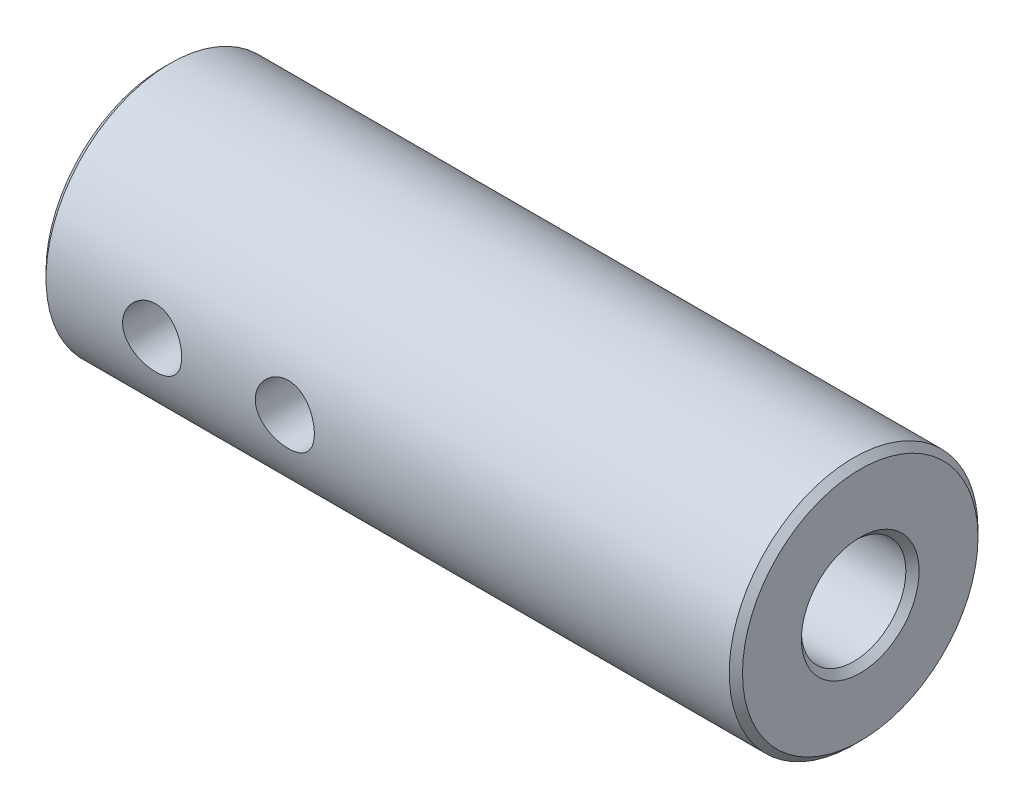
ISO-10303-21;
HEADER;
FILE_DESCRIPTION(('STEP AP214'),'2;1');
FILE_NAME('part.step','',(''),(''),'','','');
FILE_SCHEMA(('AUTOMOTIVE_DESIGN { 1 0 10303 214 1 1 1 1 }'));
ENDSEC;
DATA;
#1=APPLICATION_CONTEXT('core data for automotive mechanical design processes');
#2=APPLICATION_PROTOCOL_DEFINITION('international standard','automotive_design',2000,#1);
#3=PRODUCT_CONTEXT('',#1,'mechanical');
#4=PRODUCT('Part','Part','',(#3));
#5=PRODUCT_RELATED_PRODUCT_CATEGORY('part','',(#4));
#6=PRODUCT_DEFINITION_FORMATION('','',#4);
#7=PRODUCT_DEFINITION_CONTEXT('part definition',#1,'design');
#8=PRODUCT_DEFINITION('design','',#6,#7);
#9=PRODUCT_DEFINITION_SHAPE('','',#8);
#10=(LENGTH_UNIT() NAMED_UNIT(*) SI_UNIT(.MILLI.,.METRE.));
#11=(NAMED_UNIT(*) PLANE_ANGLE_UNIT() SI_UNIT($,.RADIAN.));
#12=(NAMED_UNIT(*) SI_UNIT($,.STERADIAN.) SOLID_ANGLE_UNIT());
#13=UNCERTAINTY_MEASURE_WITH_UNIT(LENGTH_MEASURE(1.E-05),#10,'distance_accuracy_value','');
#14=(GEOMETRIC_REPRESENTATION_CONTEXT(3) GLOBAL_UNCERTAINTY_ASSIGNED_CONTEXT((#13)) GLOBAL_UNIT_ASSIGNED_CONTEXT((#10,
#11,#12)) REPRESENTATION_CONTEXT('',''));
#15=CARTESIAN_POINT('',(0.,0.,0.));
#16=DIRECTION('',(0.,0.,1.));
#17=DIRECTION('',(1.,0.,0.));
#18=AXIS2_PLACEMENT_3D('',#15,#16,#17);
#19=CARTESIAN_POINT('',(13.335,0.,0.));
#20=DIRECTION('',(-1.,0.,0.));
#21=DIRECTION('',(0.,0.,1.));
#22=AXIS2_PLACEMENT_3D('',#19,#20,#21);
#23=CYLINDRICAL_SURFACE('',#22,4.7625);
#24=CARTESIAN_POINT('',(13.081,0.,0.));
#25=DIRECTION('',(1.,0.,0.));
#26=DIRECTION('',(0.,0.,-1.));
#27=AXIS2_PLACEMENT_3D('',#24,#25,#26);
#28=CIRCLE('',#27,4.7625);
#29=CARTESIAN_POINT('',(13.081,0.,-4.7625));
#30=VERTEX_POINT('',#29);
#31=EDGE_CURVE('E11',#30,#30,#28,.F.);
#32=ORIENTED_EDGE('',*,*,#31,.T.);
#33=EDGE_LOOP('',(#32));
#34=FACE_BOUND('',#33,.T.);
#35=CARTESIAN_POINT('',(-13.081,0.,0.));
#36=DIRECTION('',(1.,0.,0.));
#37=DIRECTION('',(0.,0.,-1.));
#38=AXIS2_PLACEMENT_3D('',#35,#36,#37);
#39=CIRCLE('',#38,4.7625);
#40=CARTESIAN_POINT('',(-13.081,0.,-4.7625));
#41=VERTEX_POINT('',#40);
#42=EDGE_CURVE('E41',#41,#41,#39,.T.);
#43=ORIENTED_EDGE('',*,*,#42,.T.);
#44=EDGE_LOOP('',(#43));
#45=FACE_BOUND('',#44,.T.);
#46=DIRECTION('',(-1.,0.,0.));
#47=VECTOR('',#46,1.);
#48=CARTESIAN_POINT('',(13.335,1.190625,-4.61127079657821));
#49=LINE('',#48,#47);
#50=CARTESIAN_POINT('',(4.7625,1.190625,-4.61127079657821));
#51=VERTEX_POINT('',#50);
#52=CARTESIAN_POINT('',(-7.9375,1.190625,-4.6112707965782));
#53=VERTEX_POINT('',#52);
#54=EDGE_CURVE('E56',#51,#53,#49,.T.);
#55=ORIENTED_EDGE('',*,*,#54,.T.);
#56=CARTESIAN_POINT('',(-7.9375,1.190625,-4.6112707965782));
#57=CARTESIAN_POINT('',(-7.97043624164247,1.19062540183131,-4.61126858153273));
#58=CARTESIAN_POINT('',(-8.00335616315608,1.1892574569063,-4.61162411846089));
#59=CARTESIAN_POINT('',(-8.06894980453331,1.18380426108057,-4.61302780372209));
#60=CARTESIAN_POINT('',(-8.10162356488994,1.17971946742247,-4.61407583550883));
#61=CARTESIAN_POINT('',(-8.19878643435178,1.16344926938982,-4.61821662126101));
#62=CARTESIAN_POINT('',(-8.26260785778663,1.14724778706475,-4.6223063249905));
#63=CARTESIAN_POINT('',(-8.38651406472165,1.10465958453277,-4.63266737518841));
#64=CARTESIAN_POINT('',(-8.44659919874718,1.07827382145776,-4.63893851663701));
#65=CARTESIAN_POINT('',(-8.56152019354573,1.01609768446205,-4.65295219480652));
#66=CARTESIAN_POINT('',(-8.61635464133268,0.980304788684349,-4.66069512592942));
#67=CARTESIAN_POINT('',(-8.72038818439445,0.899498699270296,-4.67696862417649));
#68=CARTESIAN_POINT('',(-8.76945503643607,0.854317810645922,-4.68551169943803));
#69=CARTESIAN_POINT('',(-8.85940342529035,0.756375226177138,-4.70231514921718));
#70=CARTESIAN_POINT('',(-8.90028365371027,0.703612320879485,-4.71057547837146));
#71=CARTESIAN_POINT('',(-8.9732377863022,0.59109399585014,-4.72602142030992));
#72=CARTESIAN_POINT('',(-9.00518093865592,0.531251327085735,-4.73319044011685));
#73=CARTESIAN_POINT('',(-9.05850288665295,0.406839647222352,-4.74550199754607));
#74=CARTESIAN_POINT('',(-9.07988376143199,0.342271569173836,-4.75064493395316));
#75=CARTESIAN_POINT('',(-9.11105023827563,0.211626579212771,-4.75823637193606));
#76=CARTESIAN_POINT('',(-9.12106182247842,0.145606677134655,-4.76073731423111));
#77=CARTESIAN_POINT('',(-9.12991495174374,0.0127787110460022,-4.76294574798315));
#78=CARTESIAN_POINT('',(-9.12875790076025,-0.0540292528466751,-4.76265359054695));
#79=CARTESIAN_POINT('',(-9.11546869948701,-0.1849665619449,-4.75934766988579));
#80=CARTESIAN_POINT('',(-9.10358072211125,-0.249122448009013,-4.75639445925233));
#81=CARTESIAN_POINT('',(-9.06955972884804,-0.37449765288479,-4.74816881164078));
#82=CARTESIAN_POINT('',(-9.04742625966991,-0.435716841636058,-4.74289627204928));
#83=CARTESIAN_POINT('',(-8.99334472520151,-0.554125549922964,-4.73053169210141));
#84=CARTESIAN_POINT('',(-8.96130963374153,-0.611273577745175,-4.72342361400933));
#85=CARTESIAN_POINT('',(-8.88840083604203,-0.719466864058233,-4.70815922660848));
#86=CARTESIAN_POINT('',(-8.84752579822976,-0.770511201341348,-4.70000275945464));
#87=CARTESIAN_POINT('',(-8.75679417030319,-0.86650042962167,-4.68327064545974));
#88=CARTESIAN_POINT('',(-8.70672514524479,-0.911243775823818,-4.67468962599994));
#89=CARTESIAN_POINT('',(-8.59969006468917,-0.991754400456112,-4.65827469113145));
#90=CARTESIAN_POINT('',(-8.54272212749676,-1.02751922176052,-4.65044098059939));
#91=CARTESIAN_POINT('',(-8.42310164759108,-1.0891893569936,-4.63638678051219));
#92=CARTESIAN_POINT('',(-8.3604201621081,-1.11504057442203,-4.63017519967129));
#93=CARTESIAN_POINT('',(-8.23144515710198,-1.1557424876712,-4.6201852939215));
#94=CARTESIAN_POINT('',(-8.16515719746222,-1.17060962840569,-4.61640333259709));
#95=CARTESIAN_POINT('',(-8.07149605603393,-1.18336770622658,-4.6131395546769));
#96=CARTESIAN_POINT('',(-8.04475185336181,-1.18608966049473,-4.61243985328867));
#97=CARTESIAN_POINT('',(-7.99117600638921,-1.18971626463346,-4.61150568150935));
#98=CARTESIAN_POINT('',(-7.96434457425323,-1.1906238547331,-4.61127045842546));
#99=CARTESIAN_POINT('',(-7.9375,-1.190625,-4.61127079657821));
#100=B_SPLINE_CURVE_WITH_KNOTS('',3,(#56,#57,#58,#59,#60,#61,#62,#63,#64,#65,#66,#67,#68,#69,
#70,#71,#72,#73,#74,#75,#76,#77,#78,#79,#80,#81,#82,#83,#84,#85,#86,#87,#88,#89,#90,#91,#92,#93,
#94,#95,#96,#97,#98,#99),.UNSPECIFIED.,.F.,.F.,(4,2,2,2,2,2,2,2,2,2,2,2,2,2,2,2,2,2,2,2,2,4),
(0.,0.0987463064357856,0.197475998182037,0.394370674792503,0.591246851490192,0.788175860534038,
0.988983009125182,1.1898222253076,1.39346210263836,1.59706187840793,1.79653979554183,
1.99599263761811,2.19101843211262,2.3860528559467,2.58285269064354,2.77968219023154,
2.98181827039564,3.18400960837339,3.38728907441771,3.59026357852295,3.67088557385403,
3.75137681268021),.UNSPECIFIED.);
#101=CARTESIAN_POINT('',(-7.9375,-1.190625,-4.6112707965782));
#102=VERTEX_POINT('',#101);
#103=EDGE_CURVE('E137',#53,#102,#100,.T.);
#104=ORIENTED_EDGE('',*,*,#103,.T.);
#105=DIRECTION('',(-1.,0.,0.));
#106=VECTOR('',#105,1.);
#107=CARTESIAN_POINT('',(13.335,-1.190625,-4.6112707965782));
#108=LINE('',#107,#106);
#109=CARTESIAN_POINT('',(4.7625,-1.190625,-4.6112707965782));
#110=VERTEX_POINT('',#109);
#111=EDGE_CURVE('E136',#102,#110,#108,.F.);
#112=ORIENTED_EDGE('',*,*,#111,.T.);
#113=CARTESIAN_POINT('',(4.7625,-1.190625,-4.61127079657821));
#114=CARTESIAN_POINT('',(4.79543624164248,-1.19062540183131,-4.61126858153273));
#115=CARTESIAN_POINT('',(4.82835616315608,-1.1892574569063,-4.61162411846089));
#116=CARTESIAN_POINT('',(4.89394980453331,-1.18380426108057,-4.61302780372209));
#117=CARTESIAN_POINT('',(4.92662356488994,-1.17971946742247,-4.61407583550884));
#118=CARTESIAN_POINT('',(5.02378643435178,-1.16344926938982,-4.61821662126101));
#119=CARTESIAN_POINT('',(5.08760785778663,-1.14724778706475,-4.62230632499051));
#120=CARTESIAN_POINT('',(5.21151406472165,-1.10465958453277,-4.63266737518841));
#121=CARTESIAN_POINT('',(5.27159919874718,-1.07827382145775,-4.63893851663701));
#122=CARTESIAN_POINT('',(5.38652019354573,-1.01609768446205,-4.65295219480652));
#123=CARTESIAN_POINT('',(5.44135464133268,-0.980304788684347,-4.66069512592942));
#124=CARTESIAN_POINT('',(5.54538818439445,-0.899498699270294,-4.67696862417649));
#125=CARTESIAN_POINT('',(5.59445503643607,-0.854317810645921,-4.68551169943803));
#126=CARTESIAN_POINT('',(5.68440342529035,-0.756375226177137,-4.70231514921718));
#127=CARTESIAN_POINT('',(5.72528365371027,-0.703612320879484,-4.71057547837146));
#128=CARTESIAN_POINT('',(5.7982377863022,-0.591093995850138,-4.72602142030992));
#129=CARTESIAN_POINT('',(5.83018093865592,-0.531251327085733,-4.73319044011685));
#130=CARTESIAN_POINT('',(5.88350288665295,-0.406839647222351,-4.74550199754607));
#131=CARTESIAN_POINT('',(5.90488376143199,-0.342271569173833,-4.75064493395316));
#132=CARTESIAN_POINT('',(5.93605023827563,-0.211626579212769,-4.75823637193606));
#133=CARTESIAN_POINT('',(5.94606182247842,-0.145606677134652,-4.76073731423111));
#134=CARTESIAN_POINT('',(5.95491495174374,-0.0127787110459995,-4.76294574798315));
#135=CARTESIAN_POINT('',(5.95375790076025,0.0540292528466779,-4.76265359054695));
#136=CARTESIAN_POINT('',(5.94046869948701,0.184966561944902,-4.75934766988579));
#137=CARTESIAN_POINT('',(5.92858072211125,0.249122448009015,-4.75639445925233));
#138=CARTESIAN_POINT('',(5.89455972884804,0.374497652884792,-4.74816881164078));
#139=CARTESIAN_POINT('',(5.87242625966991,0.43571684163606,-4.74289627204928));
#140=CARTESIAN_POINT('',(5.81834472520151,0.554125549922967,-4.73053169210141));
#141=CARTESIAN_POINT('',(5.78630963374152,0.611273577745177,-4.72342361400933));
#142=CARTESIAN_POINT('',(5.71340083604203,0.719466864058236,-4.70815922660848));
#143=CARTESIAN_POINT('',(5.67252579822976,0.77051120134135,-4.70000275945464));
#144=CARTESIAN_POINT('',(5.58179417030319,0.866500429621671,-4.68327064545974));
#145=CARTESIAN_POINT('',(5.53172514524479,0.91124377582382,-4.67468962599994));
#146=CARTESIAN_POINT('',(5.42469006468917,0.991754400456114,-4.65827469113145));
#147=CARTESIAN_POINT('',(5.36772212749676,1.02751922176053,-4.65044098059939));
#148=CARTESIAN_POINT('',(5.24810164759108,1.0891893569936,-4.63638678051219));
#149=CARTESIAN_POINT('',(5.1854201621081,1.11504057442203,-4.63017519967129));
#150=CARTESIAN_POINT('',(5.05644515710198,1.1557424876712,-4.6201852939215));
#151=CARTESIAN_POINT('',(4.99015719746222,1.17060962840569,-4.61640333259709));
#152=CARTESIAN_POINT('',(4.89649605603393,1.18336770622659,-4.6131395546769));
#153=CARTESIAN_POINT('',(4.86975185336181,1.18608966049474,-4.61243985328867));
#154=CARTESIAN_POINT('',(4.81617600638921,1.18971626463346,-4.61150568150935));
#155=CARTESIAN_POINT('',(4.78934457425323,1.1906238547331,-4.61127045842546));
#156=CARTESIAN_POINT('',(4.7625,1.190625,-4.61127079657821));
#157=B_SPLINE_CURVE_WITH_KNOTS('',3,(#113,#114,#115,#116,#117,#118,#119,#120,#121,#122,#123,
#124,#125,#126,#127,#128,#129,#130,#131,#132,#133,#134,#135,#136,#137,#138,#139,#140,#141,#142,
#143,#144,#145,#146,#147,#148,#149,#150,#151,#152,#153,#154,#155,#156),.UNSPECIFIED.,.F.,.F.,(4,
2,2,2,2,2,2,2,2,2,2,2,2,2,2,2,2,2,2,2,2,4),(0.,0.0987463064357882,0.197475998182038,
0.394370674792503,0.591246851490191,0.788175860534037,0.988983009125181,1.1898222253076,
1.39346210263836,1.59706187840793,1.79653979554184,1.99599263761811,2.19101843211262,
2.3860528559467,2.58285269064354,2.77968219023154,2.98181827039564,3.18400960837339,
3.38728907441771,3.59026357852296,3.67088557385403,3.75137681268021),.UNSPECIFIED.);
#158=EDGE_CURVE('E48',#110,#51,#157,.T.);
#159=ORIENTED_EDGE('',*,*,#158,.T.);
#160=EDGE_LOOP('',(#55,#104,#112,#159));
#161=FACE_BOUND('',#160,.T.);
#162=CARTESIAN_POINT('',(-7.88670000000001,0.,4.7625));
#163=CARTESIAN_POINT('',(-7.88670192760851,-0.0625504471650137,4.76249888658254));
#164=CARTESIAN_POINT('',(-7.89190978170714,-0.125123129283413,4.76125531619252));
#165=CARTESIAN_POINT('',(-7.91257643964307,-0.248481844038287,4.75641479439014));
#166=CARTESIAN_POINT('',(-7.92804168852836,-0.309266728250471,4.75281636336276));
#167=CARTESIAN_POINT('',(-7.96870413752154,-0.427250047842574,4.74366551356278));
#168=CARTESIAN_POINT('',(-7.99389028274124,-0.484452471724354,4.73811531503235));
#169=CARTESIAN_POINT('',(-8.05324225159371,-0.593819309373721,4.72565533763748));
#170=CARTESIAN_POINT('',(-8.08740815753329,-0.645983676957435,4.71874554631142));
#171=CARTESIAN_POINT('',(-8.16442511212147,-0.744769781920513,4.70417494660862));
#172=CARTESIAN_POINT('',(-8.2074122351177,-0.791283867055913,4.69650348465821));
#173=CARTESIAN_POINT('',(-8.30055970815086,-0.876514301242979,4.68134670992166));
#174=CARTESIAN_POINT('',(-8.35072079200094,-0.915229851617912,4.67386141627044));
#175=CARTESIAN_POINT('',(-8.4576113977317,-0.984257303274571,4.65981813018725));
#176=CARTESIAN_POINT('',(-8.51441905054017,-1.01445122919643,4.6532737183417));
#177=CARTESIAN_POINT('',(-8.63248371233283,-1.06482048280172,4.64200756588757));
#178=CARTESIAN_POINT('',(-8.69374008507448,-1.08499723988878,4.63728556525076));
#179=CARTESIAN_POINT('',(-8.81778609663537,-1.1143969583754,4.63030798184956));
#180=CARTESIAN_POINT('',(-8.88052766049331,-1.12381226659384,4.62800914824603));
#181=CARTESIAN_POINT('',(-9.00673867644944,-1.1320205269598,4.62600854277725));
#182=CARTESIAN_POINT('',(-9.0702080211146,-1.1308150272652,4.62630639240253));
#183=CARTESIAN_POINT('',(-9.19461764875476,-1.11796991019263,4.62942650333921));
#184=CARTESIAN_POINT('',(-9.25558293054618,-1.10655703472154,4.63219390421103));
#185=CARTESIAN_POINT('',(-9.37470790680083,-1.07398179717215,4.63985416565764));
#186=CARTESIAN_POINT('',(-9.4328674188249,-1.05281880205468,4.64474716423846));
#187=CARTESIAN_POINT('',(-9.5453502308673,-1.00114461591173,4.65615920388045));
#188=CARTESIAN_POINT('',(-9.59963324911748,-0.97054909223566,4.66269281104616));
#189=CARTESIAN_POINT('',(-9.70237719592243,-0.900937448372102,4.6766413798207));
#190=CARTESIAN_POINT('',(-9.7508371973354,-0.861919990000867,4.68405648140832));
#191=CARTESIAN_POINT('',(-9.84186151096834,-0.775386694919819,4.69916539760802));
#192=CARTESIAN_POINT('',(-9.88424314962247,-0.727678881710187,4.70686148789115));
#193=CARTESIAN_POINT('',(-9.96043697261253,-0.625742654598686,4.72149336042034));
#194=CARTESIAN_POINT('',(-9.99424894353392,-0.571514078356699,4.72842912372917));
#195=CARTESIAN_POINT('',(-10.0524013650433,-0.45783091870798,4.7407880498009));
#196=CARTESIAN_POINT('',(-10.07671456182,-0.39836188911095,4.7462068476709));
#197=CARTESIAN_POINT('',(-10.1149498440921,-0.276024255491214,4.75488931700387));
#198=CARTESIAN_POINT('',(-10.1288737157628,-0.21315623783065,4.75815335891022));
#199=CARTESIAN_POINT('',(-10.1456617208301,-0.0873691590361525,4.76210460266796));
#200=CARTESIAN_POINT('',(-10.1487749309216,-0.0244851159606706,4.76284982691246));
#201=CARTESIAN_POINT('',(-10.1445330105785,0.100904914262535,4.76184360723796));
#202=CARTESIAN_POINT('',(-10.1371787238294,0.163410931471559,4.76009236453545));
#203=CARTESIAN_POINT('',(-10.1124164653175,0.285421966304747,4.75432693440289));
#204=CARTESIAN_POINT('',(-10.0951421786054,0.344955665814232,4.75034285425274));
#205=CARTESIAN_POINT('',(-10.0511811543474,0.460278770394102,4.74055923690496));
#206=CARTESIAN_POINT('',(-10.0244935239573,0.516067819691336,4.73475952750301));
#207=CARTESIAN_POINT('',(-9.96196553746852,0.623325436186185,4.72184709836335));
#208=CARTESIAN_POINT('',(-9.92598280285455,0.674708549514257,4.71471447952687));
#209=CARTESIAN_POINT('',(-9.84607027324923,0.770796159921665,4.69996242077331));
#210=CARTESIAN_POINT('',(-9.80213924971063,0.815499622590925,4.69234290571582));
#211=CARTESIAN_POINT('',(-9.70642588749361,0.897968165505122,4.6772704338935));
#212=CARTESIAN_POINT('',(-9.6544923671793,0.935559392964989,4.66982480514445));
#213=CARTESIAN_POINT('',(-9.54490504386739,1.00149022808019,4.65613164810588));
#214=CARTESIAN_POINT('',(-9.48725149699102,1.0298302497261,4.64988406620905));
#215=CARTESIAN_POINT('',(-9.36817540302122,1.0762491323619,4.63935996173661));
#216=CARTESIAN_POINT('',(-9.30677744713415,1.09438832132569,4.63507187952516));
#217=CARTESIAN_POINT('',(-9.18168779325944,1.12005827002545,4.62893650286401));
#218=CARTESIAN_POINT('',(-9.11799654120204,1.12759108086312,4.62708873650104));
#219=CARTESIAN_POINT('',(-8.99189021963666,1.13173541942954,4.62607660378741));
#220=CARTESIAN_POINT('',(-8.9294846415471,1.12862381464115,4.62684420801562));
#221=CARTESIAN_POINT('',(-8.80611493291203,1.11219513075476,4.63082047949845));
#222=CARTESIAN_POINT('',(-8.74515077874982,1.09887821898312,4.63402910673));
#223=CARTESIAN_POINT('',(-8.62666143110805,1.06256106322214,4.64248992098927));
#224=CARTESIAN_POINT('',(-8.56912105619124,1.03960787796392,4.64773216751232));
#225=CARTESIAN_POINT('',(-8.45866926787406,0.984707919621938,4.65967190423071));
#226=CARTESIAN_POINT('',(-8.40575843286492,0.952760024881781,4.66636957589639));
#227=CARTESIAN_POINT('',(-8.30471827914992,0.879888490013001,4.68066337542781));
#228=CARTESIAN_POINT('',(-8.25673156757363,0.838770514374269,4.68827700003745));
#229=CARTESIAN_POINT('',(-8.16824883249812,0.749111183772151,4.7034351287937));
#230=CARTESIAN_POINT('',(-8.12775456622778,0.700568092234966,4.71097961633199));
#231=CARTESIAN_POINT('',(-8.05478364311163,0.596506539598589,4.72529205111388));
#232=CARTESIAN_POINT('',(-8.02244448812679,0.540889568123419,4.73204576758135));
#233=CARTESIAN_POINT('',(-7.96762604720683,0.424856108392296,4.74386898028089));
#234=CARTESIAN_POINT('',(-7.94513918153345,0.364443352132299,4.74893977052069));
#235=CARTESIAN_POINT('',(-7.91428646001971,0.25338613740223,4.75601012346783));
#236=CARTESIAN_POINT('',(-7.90396276292922,0.203302998812328,4.75842781496555));
#237=CARTESIAN_POINT('',(-7.89016895444635,0.102151476578725,4.76167315947544));
#238=CARTESIAN_POINT('',(-7.88669842577752,0.0510831531122652,4.76250090929605));
#239=CARTESIAN_POINT('',(-7.88670000000001,0.,4.7625));
#240=B_SPLINE_CURVE_WITH_KNOTS('',3,(#162,#163,#164,#165,#166,#167,#168,#169,#170,#171,#172,
#173,#174,#175,#176,#177,#178,#179,#180,#181,#182,#183,#184,#185,#186,#187,#188,#189,#190,#191,
#192,#193,#194,#195,#196,#197,#198,#199,#200,#201,#202,#203,#204,#205,#206,#207,#208,#209,#210,
#211,#212,#213,#214,#215,#216,#217,#218,#219,#220,#221,#222,#223,#224,#225,#226,#227,#228,#229,
#230,#231,#232,#233,#234,#235,#236,#237,#238,#239),.UNSPECIFIED.,.T.,.F.,(4,2,2,2,2,2,2,2,2,2,2,
2,2,2,2,2,2,2,2,2,2,2,2,2,2,2,2,2,2,2,2,2,2,2,2,2,2,2,4),(0.,0.187464233445307,
0.375046368371232,0.562415804978714,0.74978695903926,0.94030114953255,1.13083484137834,
1.323889669599,1.51691694186556,1.7064373300301,1.8959300929301,2.08131531006455,
2.26671256527164,2.45381796865748,2.64095312363525,2.83287860741466,3.02480887033708,
3.21728584337237,3.40972971734638,3.59770916783965,3.78567346795126,3.97116223372721,
4.15666859761833,4.34520498082454,4.53377053056522,4.72647545534146,4.91917175540808,
5.1107161261548,5.30222345023355,5.48878783947732,5.67534916987397,5.86100983556768,
6.04669366374172,6.23676713117165,6.42688512083306,6.62002158350616,6.81300919697148,
6.96611517316011,7.11921182672834),.UNSPECIFIED.);
#241=CARTESIAN_POINT('',(-7.88670000000001,0.,4.7625));
#242=VERTEX_POINT('',#241);
#243=EDGE_CURVE('E111',#242,#242,#240,.T.);
#244=ORIENTED_EDGE('',*,*,#243,.T.);
#245=EDGE_LOOP('',(#244));
#246=FACE_BOUND('',#245,.T.);
#247=CARTESIAN_POINT('',(-2.80670000000001,0.,4.7625));
#248=CARTESIAN_POINT('',(-2.80670192760851,-0.0625504471650138,4.76249888658254));
#249=CARTESIAN_POINT('',(-2.81190978170714,-0.125123129283414,4.76125531619252));
#250=CARTESIAN_POINT('',(-2.83257643964307,-0.248481844038287,4.75641479439014));
#251=CARTESIAN_POINT('',(-2.84804168852836,-0.309266728250472,4.75281636336276));
#252=CARTESIAN_POINT('',(-2.88870413752154,-0.427250047842575,4.74366551356278));
#253=CARTESIAN_POINT('',(-2.91389028274124,-0.484452471724356,4.73811531503235));
#254=CARTESIAN_POINT('',(-2.97324225159371,-0.593819309373723,4.72565533763748));
#255=CARTESIAN_POINT('',(-3.00740815753329,-0.645983676957435,4.71874554631142));
#256=CARTESIAN_POINT('',(-3.08442511212147,-0.744769781920514,4.70417494660862));
#257=CARTESIAN_POINT('',(-3.1274122351177,-0.791283867055914,4.69650348465821));
#258=CARTESIAN_POINT('',(-3.22055970815086,-0.876514301242979,4.68134670992166));
#259=CARTESIAN_POINT('',(-3.27072079200094,-0.915229851617912,4.67386141627044));
#260=CARTESIAN_POINT('',(-3.3776113977317,-0.984257303274572,4.65981813018725));
#261=CARTESIAN_POINT('',(-3.43441905054017,-1.01445122919643,4.6532737183417));
#262=CARTESIAN_POINT('',(-3.55248371233283,-1.06482048280172,4.64200756588757));
#263=CARTESIAN_POINT('',(-3.61374008507448,-1.08499723988878,4.63728556525076));
#264=CARTESIAN_POINT('',(-3.73778609663537,-1.1143969583754,4.63030798184956));
#265=CARTESIAN_POINT('',(-3.80052766049331,-1.12381226659384,4.62800914824604));
#266=CARTESIAN_POINT('',(-3.92673867644945,-1.1320205269598,4.62600854277725));
#267=CARTESIAN_POINT('',(-3.9902080211146,-1.1308150272652,4.62630639240253));
#268=CARTESIAN_POINT('',(-4.11461764875476,-1.11796991019263,4.62942650333921));
#269=CARTESIAN_POINT('',(-4.17558293054619,-1.10655703472154,4.63219390421103));
#270=CARTESIAN_POINT('',(-4.29470790680083,-1.07398179717215,4.63985416565764));
#271=CARTESIAN_POINT('',(-4.3528674188249,-1.05281880205468,4.64474716423846));
#272=CARTESIAN_POINT('',(-4.4653502308673,-1.00114461591173,4.65615920388045));
#273=CARTESIAN_POINT('',(-4.51963324911748,-0.97054909223566,4.66269281104616));
#274=CARTESIAN_POINT('',(-4.62237719592242,-0.900937448372103,4.6766413798207));
#275=CARTESIAN_POINT('',(-4.6708371973354,-0.861919990000867,4.68405648140832));
#276=CARTESIAN_POINT('',(-4.76186151096834,-0.775386694919819,4.69916539760802));
#277=CARTESIAN_POINT('',(-4.80424314962247,-0.727678881710187,4.70686148789115));
#278=CARTESIAN_POINT('',(-4.88043697261253,-0.625742654598686,4.72149336042034));
#279=CARTESIAN_POINT('',(-4.91424894353392,-0.571514078356698,4.72842912372917));
#280=CARTESIAN_POINT('',(-4.97240136504325,-0.457830918707979,4.7407880498009));
#281=CARTESIAN_POINT('',(-4.99671456182001,-0.398361889110949,4.7462068476709));
#282=CARTESIAN_POINT('',(-5.03494984409206,-0.276024255491213,4.75488931700387));
#283=CARTESIAN_POINT('',(-5.0488737157628,-0.213156237830649,4.75815335891022));
#284=CARTESIAN_POINT('',(-5.06566172083008,-0.0873691590361517,4.76210460266796));
#285=CARTESIAN_POINT('',(-5.06877493092157,-0.0244851159606698,4.76284982691246));
#286=CARTESIAN_POINT('',(-5.06453301057845,0.100904914262537,4.76184360723796));
#287=CARTESIAN_POINT('',(-5.05717872382943,0.16341093147156,4.76009236453545));
#288=CARTESIAN_POINT('',(-5.03241646531752,0.285421966304748,4.75432693440289));
#289=CARTESIAN_POINT('',(-5.01514217860543,0.344955665814232,4.75034285425274));
#290=CARTESIAN_POINT('',(-4.97118115434736,0.460278770394102,4.74055923690496));
#291=CARTESIAN_POINT('',(-4.94449352395726,0.516067819691336,4.73475952750301));
#292=CARTESIAN_POINT('',(-4.88196553746852,0.623325436186186,4.72184709836335));
#293=CARTESIAN_POINT('',(-4.84598280285455,0.674708549514258,4.71471447952687));
#294=CARTESIAN_POINT('',(-4.76607027324923,0.770796159921666,4.69996242077331));
#295=CARTESIAN_POINT('',(-4.72213924971063,0.815499622590926,4.69234290571582));
#296=CARTESIAN_POINT('',(-4.62642588749361,0.897968165505122,4.6772704338935));
#297=CARTESIAN_POINT('',(-4.5744923671793,0.935559392964989,4.66982480514445));
#298=CARTESIAN_POINT('',(-4.46490504386739,1.00149022808019,4.65613164810588));
#299=CARTESIAN_POINT('',(-4.40725149699102,1.0298302497261,4.64988406620905));
#300=CARTESIAN_POINT('',(-4.28817540302121,1.0762491323619,4.63935996173661));
#301=CARTESIAN_POINT('',(-4.22677744713415,1.09438832132569,4.63507187952516));
#302=CARTESIAN_POINT('',(-4.10168779325943,1.12005827002545,4.62893650286401));
#303=CARTESIAN_POINT('',(-4.03799654120203,1.12759108086312,4.62708873650104));
#304=CARTESIAN_POINT('',(-3.91189021963666,1.13173541942954,4.62607660378741));
#305=CARTESIAN_POINT('',(-3.8494846415471,1.12862381464115,4.62684420801562));
#306=CARTESIAN_POINT('',(-3.72611493291203,1.11219513075476,4.63082047949845));
#307=CARTESIAN_POINT('',(-3.66515077874982,1.09887821898312,4.63402910673));
#308=CARTESIAN_POINT('',(-3.54666143110805,1.06256106322214,4.64248992098927));
#309=CARTESIAN_POINT('',(-3.48912105619124,1.03960787796392,4.64773216751233));
#310=CARTESIAN_POINT('',(-3.37866926787405,0.984707919621937,4.65967190423071));
#311=CARTESIAN_POINT('',(-3.32575843286492,0.95276002488178,4.66636957589639));
#312=CARTESIAN_POINT('',(-3.22471827914991,0.879888490013,4.68066337542781));
#313=CARTESIAN_POINT('',(-3.17673156757363,0.83877051437427,4.68827700003745));
#314=CARTESIAN_POINT('',(-3.08824883249811,0.749111183772152,4.7034351287937));
#315=CARTESIAN_POINT('',(-3.04775456622778,0.700568092234966,4.71097961633199));
#316=CARTESIAN_POINT('',(-2.97478364311163,0.596506539598588,4.72529205111388));
#317=CARTESIAN_POINT('',(-2.94244448812679,0.540889568123418,4.73204576758136));
#318=CARTESIAN_POINT('',(-2.88762604720683,0.424856108392295,4.74386898028089));
#319=CARTESIAN_POINT('',(-2.86513918153345,0.364443352132297,4.74893977052069));
#320=CARTESIAN_POINT('',(-2.83428646001971,0.253386137402228,4.75601012346783));
#321=CARTESIAN_POINT('',(-2.82396276292922,0.203302998812327,4.75842781496555));
#322=CARTESIAN_POINT('',(-2.81016895444635,0.102151476578724,4.76167315947544));
#323=CARTESIAN_POINT('',(-2.80669842577752,0.0510831531122649,4.76250090929605));
#324=CARTESIAN_POINT('',(-2.80670000000001,0.,4.7625));
#325=B_SPLINE_CURVE_WITH_KNOTS('',3,(#247,#248,#249,#250,#251,#252,#253,#254,#255,#256,#257,
#258,#259,#260,#261,#262,#263,#264,#265,#266,#267,#268,#269,#270,#271,#272,#273,#274,#275,#276,
#277,#278,#279,#280,#281,#282,#283,#284,#285,#286,#287,#288,#289,#290,#291,#292,#293,#294,#295,
#296,#297,#298,#299,#300,#301,#302,#303,#304,#305,#306,#307,#308,#309,#310,#311,#312,#313,#314,
#315,#316,#317,#318,#319,#320,#321,#322,#323,#324),.UNSPECIFIED.,.T.,.F.,(4,2,2,2,2,2,2,2,2,2,2,
2,2,2,2,2,2,2,2,2,2,2,2,2,2,2,2,2,2,2,2,2,2,2,2,2,2,2,4),(0.,0.187464233445307,
0.375046368371232,0.562415804978716,0.749786959039261,0.940301149532551,1.13083484137834,
1.323889669599,1.51691694186556,1.7064373300301,1.8959300929301,2.08131531006456,
2.26671256527163,2.45381796865748,2.64095312363525,2.83287860741466,3.02480887033708,
3.21728584337237,3.40972971734638,3.59770916783964,3.78567346795126,3.97116223372721,
4.15666859761832,4.34520498082454,4.53377053056521,4.72647545534146,4.91917175540807,
5.1107161261548,5.30222345023355,5.48878783947732,5.67534916987397,5.86100983556768,
6.04669366374171,6.23676713117165,6.42688512083306,6.62002158350616,6.81300919697149,
6.96611517316011,7.11921182672834),.UNSPECIFIED.);
#326=CARTESIAN_POINT('',(-2.80670000000001,0.,4.7625));
#327=VERTEX_POINT('',#326);
#328=EDGE_CURVE('E155',#327,#327,#325,.T.);
#329=ORIENTED_EDGE('',*,*,#328,.T.);
#330=EDGE_LOOP('',(#329));
#331=FACE_BOUND('',#330,.T.);
#332=ADVANCED_FACE('F33',(#34,#45,#161,#246,#331),#23,.T.);
#333=CARTESIAN_POINT('',(13.335,0.,0.));
#334=DIRECTION('',(1.,0.,0.));
#335=DIRECTION('',(0.,0.,-1.));
#336=AXIS2_PLACEMENT_3D('',#333,#334,#335);
#337=PLANE('',#336);
#338=CARTESIAN_POINT('',(13.335,0.,0.));
#339=DIRECTION('',(1.,0.,0.));
#340=DIRECTION('',(0.,0.,-1.));
#341=AXIS2_PLACEMENT_3D('',#338,#339,#340);
#342=CIRCLE('',#341,2.254);
#343=CARTESIAN_POINT('',(13.335,0.,-2.254));
#344=VERTEX_POINT('',#343);
#345=EDGE_CURVE('E182',#344,#344,#342,.F.);
#346=ORIENTED_EDGE('',*,*,#345,.T.);
#347=EDGE_LOOP('',(#346));
#348=FACE_BOUND('',#347,.T.);
#349=CARTESIAN_POINT('',(13.335,0.,0.));
#350=DIRECTION('',(1.,0.,0.));
#351=DIRECTION('',(0.,0.,-1.));
#352=AXIS2_PLACEMENT_3D('',#349,#350,#351);
#353=CIRCLE('',#352,4.50850000000001);
#354=CARTESIAN_POINT('',(13.335,0.,-4.50850000000001));
#355=VERTEX_POINT('',#354);
#356=EDGE_CURVE('E185',#355,#355,#353,.T.);
#357=ORIENTED_EDGE('',*,*,#356,.T.);
#358=EDGE_LOOP('',(#357));
#359=FACE_BOUND('',#358,.T.);
#360=ADVANCED_FACE('F147',(#348,#359),#337,.T.);
#361=CARTESIAN_POINT('',(-13.335,0.,0.));
#362=DIRECTION('',(1.,0.,0.));
#363=DIRECTION('',(0.,0.,-1.));
#364=AXIS2_PLACEMENT_3D('',#361,#362,#363);
#365=PLANE('',#364);
#366=CARTESIAN_POINT('',(-13.335,0.,0.));
#367=DIRECTION('',(1.,0.,0.));
#368=DIRECTION('',(0.,0.,-1.));
#369=AXIS2_PLACEMENT_3D('',#366,#367,#368);
#370=CIRCLE('',#369,2.254);
#371=CARTESIAN_POINT('',(-13.335,0.,-2.254));
#372=VERTEX_POINT('',#371);
#373=EDGE_CURVE('E198',#372,#372,#370,.T.);
#374=ORIENTED_EDGE('',*,*,#373,.T.);
#375=EDGE_LOOP('',(#374));
#376=FACE_BOUND('',#375,.T.);
#377=CARTESIAN_POINT('',(-13.335,0.,0.));
#378=DIRECTION('',(1.,0.,0.));
#379=DIRECTION('',(0.,0.,-1.));
#380=AXIS2_PLACEMENT_3D('',#377,#378,#379);
#381=CIRCLE('',#380,4.5085);
#382=CARTESIAN_POINT('',(-13.335,0.,-4.5085));
#383=VERTEX_POINT('',#382);
#384=EDGE_CURVE('E189',#383,#383,#381,.F.);
#385=ORIENTED_EDGE('',*,*,#384,.T.);
#386=EDGE_LOOP('',(#385));
#387=FACE_BOUND('',#386,.T.);
#388=ADVANCED_FACE('F149',(#376,#387),#365,.F.);
#389=CARTESIAN_POINT('',(-13.335,0.,0.));
#390=DIRECTION('',(1.,0.,0.));
#391=DIRECTION('',(0.,0.,-1.));
#392=AXIS2_PLACEMENT_3D('',#389,#390,#391);
#393=CYLINDRICAL_SURFACE('',#392,2.);
#394=CARTESIAN_POINT('',(13.081,0.,0.));
#395=DIRECTION('',(1.,0.,0.));
#396=DIRECTION('',(0.,0.,-1.));
#397=AXIS2_PLACEMENT_3D('',#394,#395,#396);
#398=CIRCLE('',#397,2.);
#399=CARTESIAN_POINT('',(13.081,0.,-2.));
#400=VERTEX_POINT('',#399);
#401=EDGE_CURVE('E187',#400,#400,#398,.T.);
#402=ORIENTED_EDGE('',*,*,#401,.T.);
#403=EDGE_LOOP('',(#402));
#404=FACE_BOUND('',#403,.T.);
#405=CARTESIAN_POINT('',(-13.081,0.,0.));
#406=DIRECTION('',(1.,0.,0.));
#407=DIRECTION('',(0.,0.,-1.));
#408=AXIS2_PLACEMENT_3D('',#405,#406,#407);
#409=CIRCLE('',#408,2.);
#410=CARTESIAN_POINT('',(-13.081,0.,-2.));
#411=VERTEX_POINT('',#410);
#412=EDGE_CURVE('E192',#411,#411,#409,.F.);
#413=ORIENTED_EDGE('',*,*,#412,.T.);
#414=EDGE_LOOP('',(#413));
#415=FACE_BOUND('',#414,.T.);
#416=CARTESIAN_POINT('',(-7.88670000000001,0.,2.));
#417=CARTESIAN_POINT('',(-7.88669679899417,0.058521666418513,2.00000281434894));
#418=CARTESIAN_POINT('',(-7.89126400927918,0.117025272482036,1.99741033507638));
#419=CARTESIAN_POINT('',(-7.90927455365907,0.232205838917471,1.98731520515412));
#420=CARTESIAN_POINT('',(-7.92271842385069,0.288882688747476,1.979812257942));
#421=CARTESIAN_POINT('',(-7.95776733766676,0.398640984962603,1.96065867872981));
#422=CARTESIAN_POINT('',(-7.97934220302496,0.451734880687037,1.94902339303502));
#423=CARTESIAN_POINT('',(-8.02982994330583,0.553443971358296,1.92261908498157));
#424=CARTESIAN_POINT('',(-8.05874464345156,0.602058048187923,1.90784928330158));
#425=CARTESIAN_POINT('',(-8.12539035660279,0.697298681650617,1.87522936059271));
#426=CARTESIAN_POINT('',(-8.16360175456878,0.743538710031349,1.85723495271002));
#427=CARTESIAN_POINT('',(-8.24669609864884,0.829326098824807,1.82054920459216));
#428=CARTESIAN_POINT('',(-8.29158607056881,0.868866316249154,1.80185714613718));
#429=CARTESIAN_POINT('',(-8.39238949608388,0.944359147800898,1.7635644404062));
#430=CARTESIAN_POINT('',(-8.4489667087106,0.979489932483486,1.7440768104855));
#431=CARTESIAN_POINT('',(-8.56835556989918,1.03958877180617,1.70893943070698));
#432=CARTESIAN_POINT('',(-8.63115783563226,1.06457184051277,1.69328402461558));
#433=CARTESIAN_POINT('',(-8.74726014139197,1.09893013064842,1.67113022309168));
#434=CARTESIAN_POINT('',(-8.79966758273917,1.11051509773012,1.66338231551543));
#435=CARTESIAN_POINT('',(-8.90606610959481,1.12612381026147,1.65285748080119));
#436=CARTESIAN_POINT('',(-8.9600554957573,1.13015538757831,1.65007540489366));
#437=CARTESIAN_POINT('',(-9.06813035183506,1.13043713690895,1.64988238850315));
#438=CARTESIAN_POINT('',(-9.12221585738339,1.12667755327894,1.65247818187777));
#439=CARTESIAN_POINT('',(-9.22884322237551,1.11157754948026,1.66267099881706));
#440=CARTESIAN_POINT('',(-9.28138401931518,1.100232033173,1.67027138435452));
#441=CARTESIAN_POINT('',(-9.38352042413319,1.07054477321197,1.68945004397183));
#442=CARTESIAN_POINT('',(-9.43312218025698,1.05221827671026,1.70101964346174));
#443=CARTESIAN_POINT('',(-9.52870485977087,1.00920097865741,1.72688797706283));
#444=CARTESIAN_POINT('',(-9.57468437545275,0.984507718570583,1.74118776488571));
#445=CARTESIAN_POINT('',(-9.66937991416953,0.924974677264344,1.7736238343654));
#446=CARTESIAN_POINT('',(-9.71739243326043,0.889150600063214,1.79200998200572));
#447=CARTESIAN_POINT('',(-9.80717349379751,0.810415692413589,1.82896701661007));
#448=CARTESIAN_POINT('',(-9.84893681296728,0.767498997194688,1.84753804440489));
#449=CARTESIAN_POINT('',(-9.9295979482536,0.67019104461814,1.88516546178562));
#450=CARTESIAN_POINT('',(-9.96768954354406,0.615059363820605,1.90405480052508));
#451=CARTESIAN_POINT('',(-10.0338940397821,0.49801170918816,1.93795935850136));
#452=CARTESIAN_POINT('',(-10.0620133585777,0.436100132389091,1.95297706769322));
#453=CARTESIAN_POINT('',(-10.1053173313556,0.311720404697395,1.97649944477082));
#454=CARTESIAN_POINT('',(-10.1212691514719,0.249594093268898,1.98538620557394));
#455=CARTESIAN_POINT('',(-10.1424132108793,0.123003466440146,1.99722237223993));
#456=CARTESIAN_POINT('',(-10.1476156091267,0.058541417169274,2.00017738394562));
#457=CARTESIAN_POINT('',(-10.1469930675364,-0.0626574527666465,1.99982740368587));
#458=CARTESIAN_POINT('',(-10.1423980868079,-0.119407384786577,1.99722061150783));
#459=CARTESIAN_POINT('',(-10.1248509311163,-0.231179528814099,1.98738587046469));
#460=CARTESIAN_POINT('',(-10.1118985590313,-0.286201700037696,1.98015781259998));
#461=CARTESIAN_POINT('',(-10.0783552284195,-0.392681275218699,1.96181098572252));
#462=CARTESIAN_POINT('',(-10.0578226578103,-0.444162449184842,1.95072199250304));
#463=CARTESIAN_POINT('',(-10.0098529785763,-0.542992942546644,1.92555511763023));
#464=CARTESIAN_POINT('',(-9.98241413492849,-0.59034121962686,1.91147648504625));
#465=CARTESIAN_POINT('',(-9.9181952652736,-0.684850391999949,1.87981754457874));
#466=CARTESIAN_POINT('',(-9.88074129267558,-0.731481768229959,1.8620254569412));
#467=CARTESIAN_POINT('',(-9.79913997751031,-0.81815922719074,1.82560424242932));
#468=CARTESIAN_POINT('',(-9.7549850792038,-0.858197768440214,1.80697418759018));
#469=CARTESIAN_POINT('',(-9.65563863512106,-0.934916980871605,1.7686038230915));
#470=CARTESIAN_POINT('',(-9.59977127717874,-0.970776774602573,1.74895878030544));
#471=CARTESIAN_POINT('',(-9.48172698749837,-1.03248551023893,1.71325730180918));
#472=CARTESIAN_POINT('',(-9.41955883648922,-1.05834814841041,1.69719596921152));
#473=CARTESIAN_POINT('',(-9.30410365360832,-1.09452961285996,1.67402669677024));
#474=CARTESIAN_POINT('',(-9.25172119169935,-1.10697959092026,1.66574332556676));
#475=CARTESIAN_POINT('',(-9.14520283087561,-1.1242977401824,1.65410628887089));
#476=CARTESIAN_POINT('',(-9.09106889563315,-1.1291741210752,1.65074728564297));
#477=CARTESIAN_POINT('',(-8.98250429375406,-1.13107947791354,1.649442658901));
#478=CARTESIAN_POINT('',(-8.92807328008022,-1.12809516584304,1.65150620185249));
#479=CARTESIAN_POINT('',(-8.82062303665614,-1.11442889709883,1.66075674405301));
#480=CARTESIAN_POINT('',(-8.767604730173,-1.10374202850063,1.6679470125863));
#481=CARTESIAN_POINT('',(-8.66492192879179,-1.07537303862124,1.68637224187716));
#482=CARTESIAN_POINT('',(-8.6152260792265,-1.05777209081474,1.69756013617961));
#483=CARTESIAN_POINT('',(-8.51935882842963,-1.01620111396715,1.72276662409719));
#484=CARTESIAN_POINT('',(-8.47318876485237,-0.992228682940025,1.73678628478073));
#485=CARTESIAN_POINT('',(-8.3781694244527,-0.934357208526526,1.7686791781705));
#486=CARTESIAN_POINT('',(-8.3299906093382,-0.899500657755185,1.78681383691341));
#487=CARTESIAN_POINT('',(-8.23971377145029,-0.822750980444518,1.82342844039797));
#488=CARTESIAN_POINT('',(-8.19762077440658,-0.780852099323522,1.84190865644328));
#489=CARTESIAN_POINT('',(-8.11577123206917,-0.685390508805018,1.8796721131827));
#490=CARTESIAN_POINT('',(-8.07685422622577,-0.631038249704466,1.89879922791856));
#491=CARTESIAN_POINT('',(-8.00883459390115,-0.515432819320053,1.93338084279393));
#492=CARTESIAN_POINT('',(-7.97972770235843,-0.454182662470214,1.94883693808662));
#493=CARTESIAN_POINT('',(-7.93353533362391,-0.328628255532082,1.97381681657238));
#494=CARTESIAN_POINT('',(-7.91606790977349,-0.264503624297004,1.9835277680167));
#495=CARTESIAN_POINT('',(-7.89265799932334,-0.133576271534709,1.99661449439162));
#496=CARTESIAN_POINT('',(-7.88670365252035,-0.0667763784391469,1.99999678867604));
#497=CARTESIAN_POINT('',(-7.88670000000001,0.,2.));
#498=B_SPLINE_CURVE_WITH_KNOTS('',3,(#416,#417,#418,#419,#420,#421,#422,#423,#424,#425,#426,
#427,#428,#429,#430,#431,#432,#433,#434,#435,#436,#437,#438,#439,#440,#441,#442,#443,#444,#445,
#446,#447,#448,#449,#450,#451,#452,#453,#454,#455,#456,#457,#458,#459,#460,#461,#462,#463,#464,
#465,#466,#467,#468,#469,#470,#471,#472,#473,#474,#475,#476,#477,#478,#479,#480,#481,#482,#483,
#484,#485,#486,#487,#488,#489,#490,#491,#492,#493,#494,#495,#496,#497),.UNSPECIFIED.,.T.,.F.,(4,
2,2,2,2,2,2,2,2,2,2,2,2,2,2,2,2,2,2,2,2,2,2,2,2,2,2,2,2,2,2,2,2,2,2,2,2,2,2,2,4),(0.,
0.175306668150851,0.350623924736097,0.525296797310481,0.700013149039184,0.887141253172285,
1.07446762505336,1.28160783094693,1.48844043603037,1.65042200359515,1.81223552452719,
1.97425178146409,2.13637698848056,2.29815010964656,2.45998579355887,2.64722672697247,
2.83462326871724,3.04240986025082,3.25006248306099,3.44319039948562,3.63613571287107,
3.80629041377143,3.97644912817846,4.14532361621585,4.3142405720327,4.50068971933932,
4.68735068430948,4.89403416362584,5.10043347104349,5.26315556860527,5.42570115389597,
5.58852168873188,5.75144614628226,5.9125123933667,6.0736394471688,6.25941311730201,
6.44533933550599,6.6528653561877,6.86030103577636,7.06054178963128,7.26057615522214),.UNSPECIFIED.);
#499=CARTESIAN_POINT('',(-7.88670000000001,0.,2.));
#500=VERTEX_POINT('',#499);
#501=EDGE_CURVE('E101',#500,#500,#498,.T.);
#502=ORIENTED_EDGE('',*,*,#501,.T.);
#503=EDGE_LOOP('',(#502));
#504=FACE_BOUND('',#503,.T.);
#505=CARTESIAN_POINT('',(-2.80670000000001,0.,2.));
#506=CARTESIAN_POINT('',(-2.80669679899417,0.0585216664185129,2.00000281434894));
#507=CARTESIAN_POINT('',(-2.81126400927918,0.117025272482036,1.99741033507638));
#508=CARTESIAN_POINT('',(-2.82927455365907,0.232205838917471,1.98731520515412));
#509=CARTESIAN_POINT('',(-2.84271842385069,0.288882688747476,1.979812257942));
#510=CARTESIAN_POINT('',(-2.87776733766676,0.398640984962603,1.96065867872981));
#511=CARTESIAN_POINT('',(-2.89934220302495,0.451734880687037,1.94902339303502));
#512=CARTESIAN_POINT('',(-2.94982994330583,0.553443971358297,1.92261908498157));
#513=CARTESIAN_POINT('',(-2.97874464345156,0.602058048187924,1.90784928330158));
#514=CARTESIAN_POINT('',(-3.04539035660279,0.697298681650617,1.87522936059271));
#515=CARTESIAN_POINT('',(-3.08360175456878,0.743538710031349,1.85723495271002));
#516=CARTESIAN_POINT('',(-3.16669609864884,0.829326098824807,1.82054920459216));
#517=CARTESIAN_POINT('',(-3.21158607056881,0.868866316249154,1.80185714613718));
#518=CARTESIAN_POINT('',(-3.31238949608388,0.944359147800898,1.7635644404062));
#519=CARTESIAN_POINT('',(-3.36896670871059,0.979489932483486,1.7440768104855));
#520=CARTESIAN_POINT('',(-3.48835556989919,1.03958877180617,1.70893943070698));
#521=CARTESIAN_POINT('',(-3.55115783563226,1.06457184051277,1.69328402461558));
#522=CARTESIAN_POINT('',(-3.66726014139198,1.09893013064842,1.67113022309168));
#523=CARTESIAN_POINT('',(-3.71966758273917,1.11051509773012,1.66338231551543));
#524=CARTESIAN_POINT('',(-3.82606610959481,1.12612381026147,1.65285748080119));
#525=CARTESIAN_POINT('',(-3.88005549575731,1.13015538757831,1.65007540489366));
#526=CARTESIAN_POINT('',(-3.98813035183506,1.13043713690895,1.64988238850315));
#527=CARTESIAN_POINT('',(-4.04221585738339,1.12667755327894,1.65247818187777));
#528=CARTESIAN_POINT('',(-4.14884322237551,1.11157754948026,1.66267099881706));
#529=CARTESIAN_POINT('',(-4.20138401931518,1.100232033173,1.67027138435452));
#530=CARTESIAN_POINT('',(-4.3035204241332,1.07054477321197,1.68945004397183));
#531=CARTESIAN_POINT('',(-4.35312218025698,1.05221827671026,1.70101964346174));
#532=CARTESIAN_POINT('',(-4.44870485977087,1.00920097865741,1.72688797706283));
#533=CARTESIAN_POINT('',(-4.49468437545275,0.984507718570582,1.74118776488571));
#534=CARTESIAN_POINT('',(-4.58937991416953,0.924974677264342,1.7736238343654));
#535=CARTESIAN_POINT('',(-4.63739243326043,0.889150600063213,1.79200998200572));
#536=CARTESIAN_POINT('',(-4.72717349379751,0.810415692413587,1.82896701661007));
#537=CARTESIAN_POINT('',(-4.76893681296728,0.767498997194684,1.84753804440489));
#538=CARTESIAN_POINT('',(-4.8495979482536,0.670191044618136,1.88516546178562));
#539=CARTESIAN_POINT('',(-4.88768954354406,0.615059363820601,1.90405480052508));
#540=CARTESIAN_POINT('',(-4.95389403978207,0.498011709188157,1.93795935850136));
#541=CARTESIAN_POINT('',(-4.98201335857767,0.436100132389088,1.95297706769322));
#542=CARTESIAN_POINT('',(-5.02531733135555,0.311720404697392,1.97649944477082));
#543=CARTESIAN_POINT('',(-5.04126915147186,0.249594093268895,1.98538620557394));
#544=CARTESIAN_POINT('',(-5.0624132108793,0.123003466440143,1.99722237223993));
#545=CARTESIAN_POINT('',(-5.06761560912667,0.0585414171692715,2.00017738394562));
#546=CARTESIAN_POINT('',(-5.06699306753641,-0.062657452766649,1.99982740368587));
#547=CARTESIAN_POINT('',(-5.0623980868079,-0.11940738478658,1.99722061150783));
#548=CARTESIAN_POINT('',(-5.04485093111632,-0.231179528814102,1.98738587046469));
#549=CARTESIAN_POINT('',(-5.03189855903135,-0.286201700037699,1.98015781259997));
#550=CARTESIAN_POINT('',(-4.99835522841947,-0.392681275218702,1.96181098572252));
#551=CARTESIAN_POINT('',(-4.97782265781035,-0.444162449184844,1.95072199250304));
#552=CARTESIAN_POINT('',(-4.92985297857634,-0.542992942546647,1.92555511763023));
#553=CARTESIAN_POINT('',(-4.90241413492848,-0.590341219626862,1.91147648504625));
#554=CARTESIAN_POINT('',(-4.8381952652736,-0.684850391999951,1.87981754457874));
#555=CARTESIAN_POINT('',(-4.80074129267558,-0.731481768229961,1.8620254569412));
#556=CARTESIAN_POINT('',(-4.71913997751031,-0.818159227190742,1.82560424242932));
#557=CARTESIAN_POINT('',(-4.6749850792038,-0.858197768440216,1.80697418759018));
#558=CARTESIAN_POINT('',(-4.57563863512105,-0.934916980871607,1.7686038230915));
#559=CARTESIAN_POINT('',(-4.51977127717873,-0.970776774602574,1.74895878030544));
#560=CARTESIAN_POINT('',(-4.40172698749837,-1.03248551023893,1.71325730180918));
#561=CARTESIAN_POINT('',(-4.33955883648922,-1.05834814841041,1.69719596921152));
#562=CARTESIAN_POINT('',(-4.22410365360832,-1.09452961285996,1.67402669677024));
#563=CARTESIAN_POINT('',(-4.17172119169935,-1.10697959092026,1.66574332556676));
#564=CARTESIAN_POINT('',(-4.06520283087561,-1.1242977401824,1.65410628887089));
#565=CARTESIAN_POINT('',(-4.01106889563315,-1.1291741210752,1.65074728564297));
#566=CARTESIAN_POINT('',(-3.90250429375406,-1.13107947791354,1.649442658901));
#567=CARTESIAN_POINT('',(-3.84807328008021,-1.12809516584304,1.65150620185249));
#568=CARTESIAN_POINT('',(-3.74062303665613,-1.11442889709883,1.66075674405302));
#569=CARTESIAN_POINT('',(-3.687604730173,-1.10374202850063,1.6679470125863));
#570=CARTESIAN_POINT('',(-3.58492192879178,-1.07537303862124,1.68637224187716));
#571=CARTESIAN_POINT('',(-3.53522607922649,-1.05777209081474,1.69756013617961));
#572=CARTESIAN_POINT('',(-3.43935882842963,-1.01620111396715,1.7227666240972));
#573=CARTESIAN_POINT('',(-3.39318876485237,-0.992228682940022,1.73678628478073));
#574=CARTESIAN_POINT('',(-3.2981694244527,-0.934357208526523,1.7686791781705));
#575=CARTESIAN_POINT('',(-3.2499906093382,-0.899500657755182,1.78681383691341));
#576=CARTESIAN_POINT('',(-3.15971377145028,-0.822750980444514,1.82342844039797));
#577=CARTESIAN_POINT('',(-3.11762077440658,-0.780852099323517,1.84190865644328));
#578=CARTESIAN_POINT('',(-3.03577123206917,-0.685390508805013,1.87967211318271));
#579=CARTESIAN_POINT('',(-2.99685422622576,-0.63103824970446,1.89879922791856));
#580=CARTESIAN_POINT('',(-2.92883459390115,-0.515432819320047,1.93338084279393));
#581=CARTESIAN_POINT('',(-2.89972770235843,-0.454182662470207,1.94883693808662));
#582=CARTESIAN_POINT('',(-2.85353533362391,-0.328628255532077,1.97381681657238));
#583=CARTESIAN_POINT('',(-2.83606790977349,-0.264503624296999,1.9835277680167));
#584=CARTESIAN_POINT('',(-2.81265799932334,-0.133576271534706,1.99661449439162));
#585=CARTESIAN_POINT('',(-2.80670365252035,-0.0667763784391457,1.99999678867604));
#586=CARTESIAN_POINT('',(-2.80670000000001,0.,2.));
#587=B_SPLINE_CURVE_WITH_KNOTS('',3,(#505,#506,#507,#508,#509,#510,#511,#512,#513,#514,#515,
#516,#517,#518,#519,#520,#521,#522,#523,#524,#525,#526,#527,#528,#529,#530,#531,#532,#533,#534,
#535,#536,#537,#538,#539,#540,#541,#542,#543,#544,#545,#546,#547,#548,#549,#550,#551,#552,#553,
#554,#555,#556,#557,#558,#559,#560,#561,#562,#563,#564,#565,#566,#567,#568,#569,#570,#571,#572,
#573,#574,#575,#576,#577,#578,#579,#580,#581,#582,#583,#584,#585,#586),.UNSPECIFIED.,.T.,.F.,(4,
2,2,2,2,2,2,2,2,2,2,2,2,2,2,2,2,2,2,2,2,2,2,2,2,2,2,2,2,2,2,2,2,2,2,2,2,2,2,2,4),(0.,
0.175306668150851,0.350623924736097,0.525296797310481,0.700013149039184,0.887141253172285,
1.07446762505336,1.28160783094693,1.48844043603038,1.65042200359515,1.81223552452719,
1.97425178146409,2.13637698848056,2.29815010964656,2.45998579355887,2.64722672697248,
2.83462326871725,3.04240986025082,3.25006248306099,3.44319039948562,3.63613571287108,
3.80629041377143,3.97644912817846,4.14532361621586,4.3142405720327,4.50068971933932,
4.68735068430948,4.89403416362584,5.10043347104349,5.26315556860527,5.42570115389598,
5.58852168873188,5.75144614628226,5.9125123933667,6.0736394471688,6.25941311730202,
6.445339335506,6.65286535618771,6.86030103577636,7.06054178963128,7.26057615522214),.UNSPECIFIED.);
#588=CARTESIAN_POINT('',(-2.80670000000001,0.,2.));
#589=VERTEX_POINT('',#588);
#590=EDGE_CURVE('E160',#589,#589,#587,.T.);
#591=ORIENTED_EDGE('',*,*,#590,.T.);
#592=EDGE_LOOP('',(#591));
#593=FACE_BOUND('',#592,.T.);
#594=ADVANCED_FACE('F166',(#404,#415,#504,#593),#393,.F.);
#595=CARTESIAN_POINT('',(-3.937,0.,4.7625));
#596=DIRECTION('',(0.,0.,1.));
#597=DIRECTION('',(1.,0.,0.));
#598=AXIS2_PLACEMENT_3D('',#595,#596,#597);
#599=CYLINDRICAL_SURFACE('',#598,1.13029999999999);
#600=ORIENTED_EDGE('',*,*,#590,.F.);
#601=EDGE_LOOP('',(#600));
#602=FACE_BOUND('',#601,.T.);
#603=ORIENTED_EDGE('',*,*,#328,.F.);
#604=EDGE_LOOP('',(#603));
#605=FACE_BOUND('',#604,.T.);
#606=ADVANCED_FACE('F122',(#602,#605),#599,.F.);
#607=CARTESIAN_POINT('',(-9.017,0.,4.7625));
#608=DIRECTION('',(0.,0.,1.));
#609=DIRECTION('',(1.,0.,0.));
#610=AXIS2_PLACEMENT_3D('',#607,#608,#609);
#611=CYLINDRICAL_SURFACE('',#610,1.13029999999999);
#612=ORIENTED_EDGE('',*,*,#501,.F.);
#613=EDGE_LOOP('',(#612));
#614=FACE_BOUND('',#613,.T.);
#615=ORIENTED_EDGE('',*,*,#243,.F.);
#616=EDGE_LOOP('',(#615));
#617=FACE_BOUND('',#616,.T.);
#618=ADVANCED_FACE('F118',(#614,#617),#611,.F.);
#619=CARTESIAN_POINT('',(4.7625,0.,-3.571875));
#620=DIRECTION('',(0.,0.,-1.));
#621=DIRECTION('',(-1.,0.,0.));
#622=AXIS2_PLACEMENT_3D('',#619,#620,#621);
#623=CYLINDRICAL_SURFACE('',#622,1.190625);
#624=DIRECTION('',(0.,0.,-1.));
#625=VECTOR('',#624,1.);
#626=CARTESIAN_POINT('',(4.7625,-1.190625,-3.571875));
#627=LINE('',#626,#625);
#628=CARTESIAN_POINT('',(4.7625,-1.190625,-3.571875));
#629=VERTEX_POINT('',#628);
#630=EDGE_CURVE('E73',#629,#110,#627,.T.);
#631=ORIENTED_EDGE('',*,*,#630,.F.);
#632=CARTESIAN_POINT('',(4.7625,0.,-3.571875));
#633=DIRECTION('',(0.,0.,-1.));
#634=DIRECTION('',(-1.,0.,0.));
#635=AXIS2_PLACEMENT_3D('',#632,#633,#634);
#636=CIRCLE('',#635,1.190625);
#637=CARTESIAN_POINT('',(4.7625,1.190625,-3.571875));
#638=VERTEX_POINT('',#637);
#639=EDGE_CURVE('E77',#638,#629,#636,.T.);
#640=ORIENTED_EDGE('',*,*,#639,.F.);
#641=DIRECTION('',(0.,0.,-1.));
#642=VECTOR('',#641,1.);
#643=CARTESIAN_POINT('',(4.7625,1.190625,-3.571875));
#644=LINE('',#643,#642);
#645=EDGE_CURVE('E99',#638,#51,#644,.T.);
#646=ORIENTED_EDGE('',*,*,#645,.T.);
#647=ORIENTED_EDGE('',*,*,#158,.F.);
#648=EDGE_LOOP('',(#631,#640,#646,#647));
#649=FACE_BOUND('',#648,.T.);
#650=ADVANCED_FACE('F75',(#649),#623,.F.);
#651=CARTESIAN_POINT('',(4.7625,1.190625,-3.571875));
#652=DIRECTION('',(0.,1.,0.));
#653=DIRECTION('',(-1.,0.,0.));
#654=AXIS2_PLACEMENT_3D('',#651,#652,#653);
#655=PLANE('',#654);
#656=ORIENTED_EDGE('',*,*,#645,.F.);
#657=DIRECTION('',(1.,0.,0.));
#658=VECTOR('',#657,1.);
#659=CARTESIAN_POINT('',(4.7625,1.190625,-3.571875));
#660=LINE('',#659,#658);
#661=CARTESIAN_POINT('',(-7.9375,1.190625,-3.571875));
#662=VERTEX_POINT('',#661);
#663=EDGE_CURVE('E82',#662,#638,#660,.T.);
#664=ORIENTED_EDGE('',*,*,#663,.F.);
#665=DIRECTION('',(0.,0.,-1.));
#666=VECTOR('',#665,1.);
#667=CARTESIAN_POINT('',(-7.9375,1.190625,-3.571875));
#668=LINE('',#667,#666);
#669=EDGE_CURVE('E102',#662,#53,#668,.T.);
#670=ORIENTED_EDGE('',*,*,#669,.T.);
#671=ORIENTED_EDGE('',*,*,#54,.F.);
#672=EDGE_LOOP('',(#656,#664,#670,#671));
#673=FACE_BOUND('',#672,.T.);
#674=ADVANCED_FACE('F128',(#673),#655,.F.);
#675=CARTESIAN_POINT('',(-7.9375,0.,-3.571875));
#676=DIRECTION('',(0.,0.,-1.));
#677=DIRECTION('',(-1.,0.,0.));
#678=AXIS2_PLACEMENT_3D('',#675,#676,#677);
#679=CYLINDRICAL_SURFACE('',#678,1.190625);
#680=ORIENTED_EDGE('',*,*,#669,.F.);
#681=CARTESIAN_POINT('',(-7.9375,0.,-3.571875));
#682=DIRECTION('',(0.,0.,-1.));
#683=DIRECTION('',(-1.,0.,0.));
#684=AXIS2_PLACEMENT_3D('',#681,#682,#683);
#685=CIRCLE('',#684,1.190625);
#686=CARTESIAN_POINT('',(-7.9375,-1.190625,-3.571875));
#687=VERTEX_POINT('',#686);
#688=EDGE_CURVE('E91',#687,#662,#685,.T.);
#689=ORIENTED_EDGE('',*,*,#688,.F.);
#690=DIRECTION('',(0.,0.,-1.));
#691=VECTOR('',#690,1.);
#692=CARTESIAN_POINT('',(-7.9375,-1.190625,-3.571875));
#693=LINE('',#692,#691);
#694=EDGE_CURVE('E81',#687,#102,#693,.T.);
#695=ORIENTED_EDGE('',*,*,#694,.T.);
#696=ORIENTED_EDGE('',*,*,#103,.F.);
#697=EDGE_LOOP('',(#680,#689,#695,#696));
#698=FACE_BOUND('',#697,.T.);
#699=ADVANCED_FACE('F232',(#698),#679,.F.);
#700=CARTESIAN_POINT('',(4.7625,-1.190625,-3.571875));
#701=DIRECTION('',(0.,-1.,0.));
#702=DIRECTION('',(1.,0.,0.));
#703=AXIS2_PLACEMENT_3D('',#700,#701,#702);
#704=PLANE('',#703);
#705=ORIENTED_EDGE('',*,*,#694,.F.);
#706=DIRECTION('',(-1.,0.,0.));
#707=VECTOR('',#706,1.);
#708=CARTESIAN_POINT('',(4.7625,-1.190625,-3.571875));
#709=LINE('',#708,#707);
#710=EDGE_CURVE('E85',#629,#687,#709,.T.);
#711=ORIENTED_EDGE('',*,*,#710,.F.);
#712=ORIENTED_EDGE('',*,*,#630,.T.);
#713=ORIENTED_EDGE('',*,*,#111,.F.);
#714=EDGE_LOOP('',(#705,#711,#712,#713));
#715=FACE_BOUND('',#714,.T.);
#716=ADVANCED_FACE('F86',(#715),#704,.F.);
#717=CARTESIAN_POINT('',(4.7625,0.,-3.571875));
#718=DIRECTION('',(0.,0.,-1.));
#719=DIRECTION('',(-1.,0.,0.));
#720=AXIS2_PLACEMENT_3D('',#717,#718,#719);
#721=PLANE('',#720);
#722=ORIENTED_EDGE('',*,*,#639,.T.);
#723=ORIENTED_EDGE('',*,*,#710,.T.);
#724=ORIENTED_EDGE('',*,*,#688,.T.);
#725=ORIENTED_EDGE('',*,*,#663,.T.);
#726=EDGE_LOOP('',(#722,#723,#724,#725));
#727=FACE_BOUND('',#726,.T.);
#728=ADVANCED_FACE('F93',(#727),#721,.T.);
#729=CARTESIAN_POINT('',(13.081,0.,0.));
#730=DIRECTION('',(1.,0.,0.));
#731=DIRECTION('',(0.,0.,-1.));
#732=AXIS2_PLACEMENT_3D('',#729,#730,#731);
#733=CONICAL_SURFACE('',#732,2.,0.785398163397458);
#734=ORIENTED_EDGE('',*,*,#345,.F.);
#735=EDGE_LOOP('',(#734));
#736=FACE_BOUND('',#735,.T.);
#737=ORIENTED_EDGE('',*,*,#401,.F.);
#738=EDGE_LOOP('',(#737));
#739=FACE_BOUND('',#738,.T.);
#740=ADVANCED_FACE('F151',(#736,#739),#733,.F.);
#741=CARTESIAN_POINT('',(-13.335,0.,0.));
#742=DIRECTION('',(-1.,0.,0.));
#743=DIRECTION('',(0.,0.,1.));
#744=AXIS2_PLACEMENT_3D('',#741,#742,#743);
#745=CONICAL_SURFACE('',#744,2.254,0.785398163397448);
#746=ORIENTED_EDGE('',*,*,#412,.F.);
#747=EDGE_LOOP('',(#746));
#748=FACE_BOUND('',#747,.T.);
#749=ORIENTED_EDGE('',*,*,#373,.F.);
#750=EDGE_LOOP('',(#749));
#751=FACE_BOUND('',#750,.T.);
#752=ADVANCED_FACE('F211',(#748,#751),#745,.F.);
#753=CARTESIAN_POINT('',(13.335,0.,0.));
#754=DIRECTION('',(-1.,0.,0.));
#755=DIRECTION('',(0.,0.,1.));
#756=AXIS2_PLACEMENT_3D('',#753,#754,#755);
#757=CONICAL_SURFACE('',#756,4.50850000000001,0.785398163397445);
#758=ORIENTED_EDGE('',*,*,#31,.F.);
#759=EDGE_LOOP('',(#758));
#760=FACE_BOUND('',#759,.T.);
#761=ORIENTED_EDGE('',*,*,#356,.F.);
#762=EDGE_LOOP('',(#761));
#763=FACE_BOUND('',#762,.T.);
#764=ADVANCED_FACE('F206',(#760,#763),#757,.T.);
#765=CARTESIAN_POINT('',(-13.081,0.,0.));
#766=DIRECTION('',(1.,0.,0.));
#767=DIRECTION('',(0.,0.,-1.));
#768=AXIS2_PLACEMENT_3D('',#765,#766,#767);
#769=CONICAL_SURFACE('',#768,4.7625,0.785398163397455);
#770=ORIENTED_EDGE('',*,*,#384,.F.);
#771=EDGE_LOOP('',(#770));
#772=FACE_BOUND('',#771,.T.);
#773=ORIENTED_EDGE('',*,*,#42,.F.);
#774=EDGE_LOOP('',(#773));
#775=FACE_BOUND('',#774,.T.);
#776=ADVANCED_FACE('F35',(#772,#775),#769,.T.);
#777=CLOSED_SHELL('',(#332,#360,#388,#594,#606,#618,#650,#674,#699,#716,#728,#740,#752,#764,#776));
#778=MANIFOLD_SOLID_BREP('B2',#777);
#779=ADVANCED_BREP_SHAPE_REPRESENTATION('',(#18,#778),#14);
#780=SHAPE_DEFINITION_REPRESENTATION(#9,#779);
ENDSEC;
END-ISO-10303-21;
